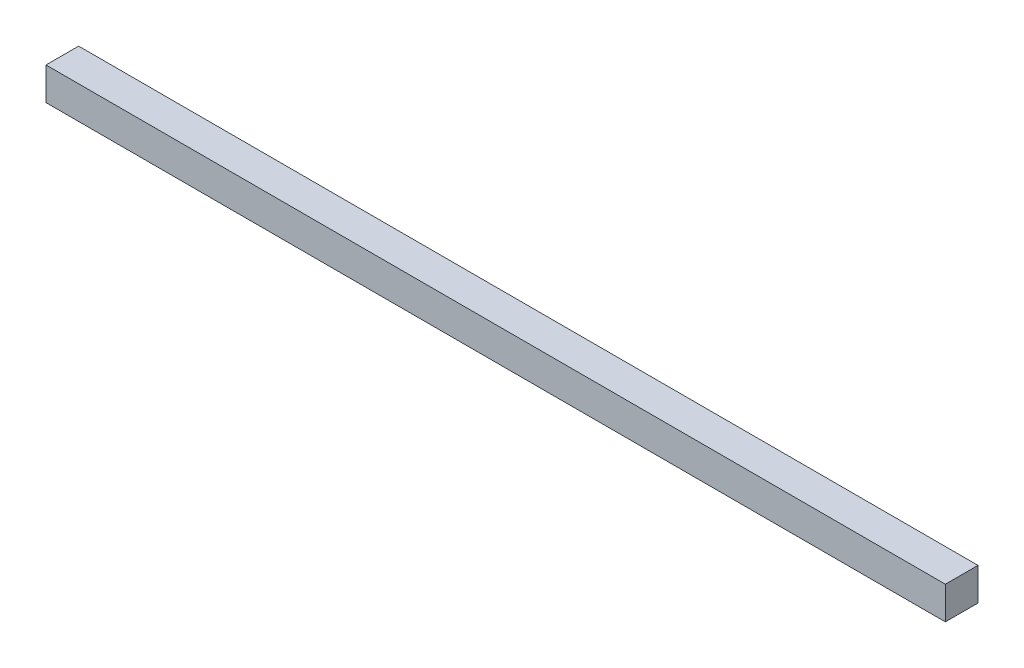
ISO-10303-21;
HEADER;
FILE_DESCRIPTION(('STEP AP214'),'2;1');
FILE_NAME('part.step','',(''),(''),'','','');
FILE_SCHEMA(('AUTOMOTIVE_DESIGN { 1 0 10303 214 1 1 1 1 }'));
ENDSEC;
DATA;
#1=APPLICATION_CONTEXT('core data for automotive mechanical design processes');
#2=APPLICATION_PROTOCOL_DEFINITION('international standard','automotive_design',2000,#1);
#3=PRODUCT_CONTEXT('',#1,'mechanical');
#4=PRODUCT('Part','Part','',(#3));
#5=PRODUCT_RELATED_PRODUCT_CATEGORY('part','',(#4));
#6=PRODUCT_DEFINITION_FORMATION('','',#4);
#7=PRODUCT_DEFINITION_CONTEXT('part definition',#1,'design');
#8=PRODUCT_DEFINITION('design','',#6,#7);
#9=PRODUCT_DEFINITION_SHAPE('','',#8);
#10=(LENGTH_UNIT() NAMED_UNIT(*) SI_UNIT(.MILLI.,.METRE.));
#11=(NAMED_UNIT(*) PLANE_ANGLE_UNIT() SI_UNIT($,.RADIAN.));
#12=(NAMED_UNIT(*) SI_UNIT($,.STERADIAN.) SOLID_ANGLE_UNIT());
#13=UNCERTAINTY_MEASURE_WITH_UNIT(LENGTH_MEASURE(1.E-05),#10,'distance_accuracy_value','');
#14=(GEOMETRIC_REPRESENTATION_CONTEXT(3) GLOBAL_UNCERTAINTY_ASSIGNED_CONTEXT((#13)) GLOBAL_UNIT_ASSIGNED_CONTEXT((#10,
#11,#12)) REPRESENTATION_CONTEXT('',''));
#15=CARTESIAN_POINT('',(0.,0.,0.));
#16=DIRECTION('',(0.,0.,1.));
#17=DIRECTION('',(1.,0.,0.));
#18=AXIS2_PLACEMENT_3D('',#15,#16,#17);
#19=CARTESIAN_POINT('',(-124.,-4.5,-4.5));
#20=DIRECTION('',(0.,0.,-1.));
#21=DIRECTION('',(-1.,0.,0.));
#22=AXIS2_PLACEMENT_3D('',#19,#20,#21);
#23=PLANE('',#22);
#24=DIRECTION('',(1.,0.,0.));
#25=VECTOR('',#24,1.);
#26=CARTESIAN_POINT('',(-124.,4.5,-4.5));
#27=LINE('',#26,#25);
#28=CARTESIAN_POINT('',(-124.,4.5,-4.5));
#29=VERTEX_POINT('',#28);
#30=CARTESIAN_POINT('',(124.,4.5,-4.5));
#31=VERTEX_POINT('',#30);
#32=EDGE_CURVE('E35',#29,#31,#27,.T.);
#33=ORIENTED_EDGE('',*,*,#32,.T.);
#34=DIRECTION('',(0.,1.,0.));
#35=VECTOR('',#34,1.);
#36=CARTESIAN_POINT('',(124.,-4.5,-4.5));
#37=LINE('',#36,#35);
#38=CARTESIAN_POINT('',(124.,-4.5,-4.5));
#39=VERTEX_POINT('',#38);
#40=EDGE_CURVE('E72',#39,#31,#37,.T.);
#41=ORIENTED_EDGE('',*,*,#40,.F.);
#42=DIRECTION('',(1.,0.,0.));
#43=VECTOR('',#42,1.);
#44=CARTESIAN_POINT('',(-124.,-4.5,-4.5));
#45=LINE('',#44,#43);
#46=CARTESIAN_POINT('',(-124.,-4.5,-4.5));
#47=VERTEX_POINT('',#46);
#48=EDGE_CURVE('E11',#47,#39,#45,.T.);
#49=ORIENTED_EDGE('',*,*,#48,.F.);
#50=DIRECTION('',(0.,1.,0.));
#51=VECTOR('',#50,1.);
#52=CARTESIAN_POINT('',(-124.,-4.5,-4.5));
#53=LINE('',#52,#51);
#54=EDGE_CURVE('E73',#47,#29,#53,.T.);
#55=ORIENTED_EDGE('',*,*,#54,.T.);
#56=EDGE_LOOP('',(#33,#41,#49,#55));
#57=FACE_BOUND('',#56,.T.);
#58=ADVANCED_FACE('F32',(#57),#23,.T.);
#59=CARTESIAN_POINT('',(-124.,-4.5,4.5));
#60=DIRECTION('',(0.,-1.,0.));
#61=DIRECTION('',(0.,0.,-1.));
#62=AXIS2_PLACEMENT_3D('',#59,#60,#61);
#63=PLANE('',#62);
#64=ORIENTED_EDGE('',*,*,#48,.T.);
#65=DIRECTION('',(0.,0.,-1.));
#66=VECTOR('',#65,1.);
#67=CARTESIAN_POINT('',(124.,-4.5,4.5));
#68=LINE('',#67,#66);
#69=CARTESIAN_POINT('',(124.,-4.5,4.5));
#70=VERTEX_POINT('',#69);
#71=EDGE_CURVE('E89',#70,#39,#68,.T.);
#72=ORIENTED_EDGE('',*,*,#71,.F.);
#73=DIRECTION('',(1.,0.,0.));
#74=VECTOR('',#73,1.);
#75=CARTESIAN_POINT('',(-124.,-4.5,4.5));
#76=LINE('',#75,#74);
#77=CARTESIAN_POINT('',(-124.,-4.5,4.5));
#78=VERTEX_POINT('',#77);
#79=EDGE_CURVE('E40',#78,#70,#76,.T.);
#80=ORIENTED_EDGE('',*,*,#79,.F.);
#81=DIRECTION('',(0.,0.,-1.));
#82=VECTOR('',#81,1.);
#83=CARTESIAN_POINT('',(-124.,-4.5,4.5));
#84=LINE('',#83,#82);
#85=EDGE_CURVE('E78',#78,#47,#84,.T.);
#86=ORIENTED_EDGE('',*,*,#85,.T.);
#87=EDGE_LOOP('',(#64,#72,#80,#86));
#88=FACE_BOUND('',#87,.T.);
#89=ADVANCED_FACE('F104',(#88),#63,.T.);
#90=CARTESIAN_POINT('',(-124.,-4.5,4.5));
#91=DIRECTION('',(0.,0.,1.));
#92=DIRECTION('',(1.,0.,0.));
#93=AXIS2_PLACEMENT_3D('',#90,#91,#92);
#94=PLANE('',#93);
#95=ORIENTED_EDGE('',*,*,#79,.T.);
#96=DIRECTION('',(0.,-1.,0.));
#97=VECTOR('',#96,1.);
#98=CARTESIAN_POINT('',(124.,-4.5,4.5));
#99=LINE('',#98,#97);
#100=CARTESIAN_POINT('',(124.,4.5,4.5));
#101=VERTEX_POINT('',#100);
#102=EDGE_CURVE('E85',#101,#70,#99,.T.);
#103=ORIENTED_EDGE('',*,*,#102,.F.);
#104=DIRECTION('',(1.,0.,0.));
#105=VECTOR('',#104,1.);
#106=CARTESIAN_POINT('',(-124.,4.5,4.5));
#107=LINE('',#106,#105);
#108=CARTESIAN_POINT('',(-124.,4.5,4.5));
#109=VERTEX_POINT('',#108);
#110=EDGE_CURVE('E77',#109,#101,#107,.T.);
#111=ORIENTED_EDGE('',*,*,#110,.F.);
#112=DIRECTION('',(0.,-1.,0.));
#113=VECTOR('',#112,1.);
#114=CARTESIAN_POINT('',(-124.,-4.5,4.5));
#115=LINE('',#114,#113);
#116=EDGE_CURVE('E97',#109,#78,#115,.T.);
#117=ORIENTED_EDGE('',*,*,#116,.T.);
#118=EDGE_LOOP('',(#95,#103,#111,#117));
#119=FACE_BOUND('',#118,.T.);
#120=ADVANCED_FACE('F101',(#119),#94,.T.);
#121=CARTESIAN_POINT('',(-124.,4.5,4.5));
#122=DIRECTION('',(0.,1.,0.));
#123=DIRECTION('',(0.,0.,1.));
#124=AXIS2_PLACEMENT_3D('',#121,#122,#123);
#125=PLANE('',#124);
#126=ORIENTED_EDGE('',*,*,#110,.T.);
#127=DIRECTION('',(0.,0.,1.));
#128=VECTOR('',#127,1.);
#129=CARTESIAN_POINT('',(124.,4.5,4.5));
#130=LINE('',#129,#128);
#131=EDGE_CURVE('E80',#31,#101,#130,.T.);
#132=ORIENTED_EDGE('',*,*,#131,.F.);
#133=ORIENTED_EDGE('',*,*,#32,.F.);
#134=DIRECTION('',(0.,0.,1.));
#135=VECTOR('',#134,1.);
#136=CARTESIAN_POINT('',(-124.,4.5,4.5));
#137=LINE('',#136,#135);
#138=EDGE_CURVE('E95',#29,#109,#137,.T.);
#139=ORIENTED_EDGE('',*,*,#138,.T.);
#140=EDGE_LOOP('',(#126,#132,#133,#139));
#141=FACE_BOUND('',#140,.T.);
#142=ADVANCED_FACE('F81',(#141),#125,.T.);
#143=CARTESIAN_POINT('',(-124.,0.,0.));
#144=DIRECTION('',(-1.,0.,0.));
#145=DIRECTION('',(0.,0.,1.));
#146=AXIS2_PLACEMENT_3D('',#143,#144,#145);
#147=PLANE('',#146);
#148=ORIENTED_EDGE('',*,*,#54,.F.);
#149=ORIENTED_EDGE('',*,*,#85,.F.);
#150=ORIENTED_EDGE('',*,*,#116,.F.);
#151=ORIENTED_EDGE('',*,*,#138,.F.);
#152=EDGE_LOOP('',(#148,#149,#150,#151));
#153=FACE_BOUND('',#152,.T.);
#154=ADVANCED_FACE('F106',(#153),#147,.T.);
#155=CARTESIAN_POINT('',(124.,0.,0.));
#156=DIRECTION('',(-1.,0.,0.));
#157=DIRECTION('',(0.,0.,1.));
#158=AXIS2_PLACEMENT_3D('',#155,#156,#157);
#159=PLANE('',#158);
#160=ORIENTED_EDGE('',*,*,#40,.T.);
#161=ORIENTED_EDGE('',*,*,#131,.T.);
#162=ORIENTED_EDGE('',*,*,#102,.T.);
#163=ORIENTED_EDGE('',*,*,#71,.T.);
#164=EDGE_LOOP('',(#160,#161,#162,#163));
#165=FACE_BOUND('',#164,.T.);
#166=ADVANCED_FACE('F88',(#165),#159,.F.);
#167=CLOSED_SHELL('',(#58,#89,#120,#142,#154,#166));
#168=MANIFOLD_SOLID_BREP('B2',#167);
#169=ADVANCED_BREP_SHAPE_REPRESENTATION('',(#18,#168),#14);
#170=SHAPE_DEFINITION_REPRESENTATION(#9,#169);
ENDSEC;
END-ISO-10303-21;
